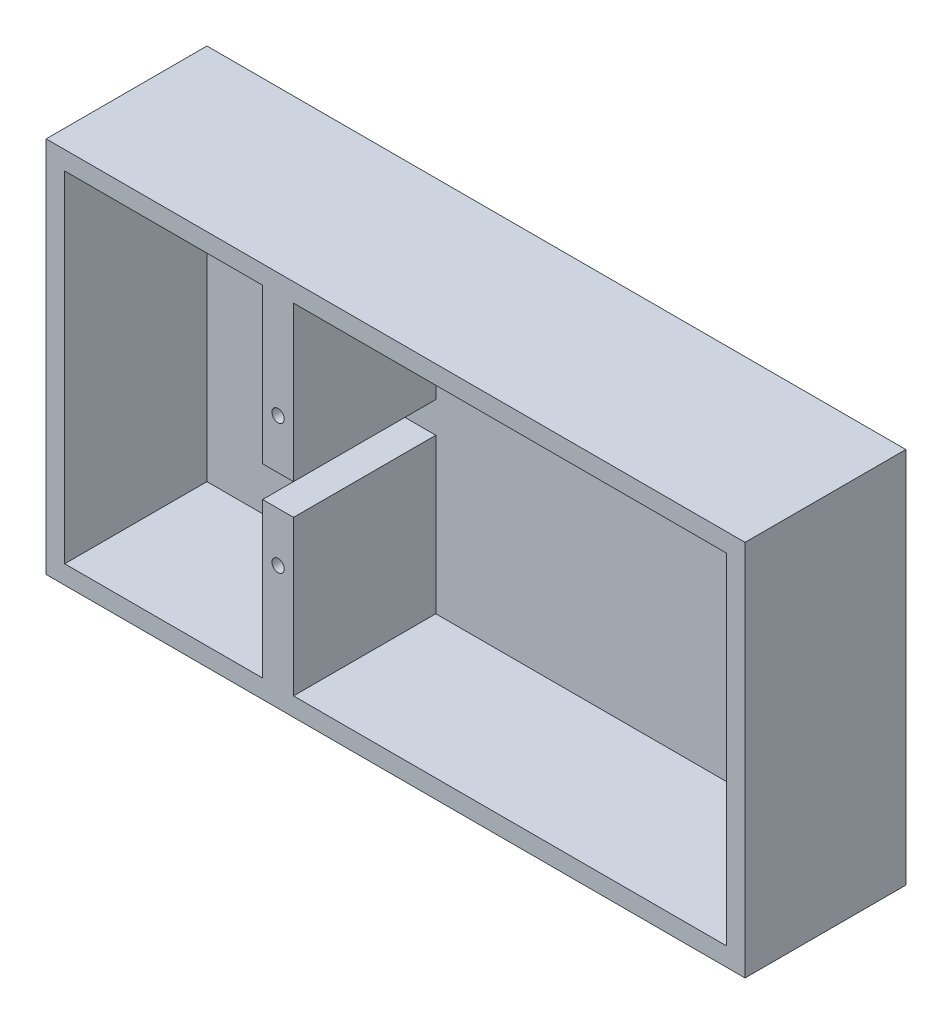
ISO-10303-21;
HEADER;
FILE_DESCRIPTION(('STEP AP214'),'2;1');
FILE_NAME('part.step','',(''),(''),'','','');
FILE_SCHEMA(('AUTOMOTIVE_DESIGN { 1 0 10303 214 1 1 1 1 }'));
ENDSEC;
DATA;
#1=APPLICATION_CONTEXT('core data for automotive mechanical design processes');
#2=APPLICATION_PROTOCOL_DEFINITION('international standard','automotive_design',2000,#1);
#3=PRODUCT_CONTEXT('',#1,'mechanical');
#4=PRODUCT('Part','Part','',(#3));
#5=PRODUCT_RELATED_PRODUCT_CATEGORY('part','',(#4));
#6=PRODUCT_DEFINITION_FORMATION('','',#4);
#7=PRODUCT_DEFINITION_CONTEXT('part definition',#1,'design');
#8=PRODUCT_DEFINITION('design','',#6,#7);
#9=PRODUCT_DEFINITION_SHAPE('','',#8);
#10=(LENGTH_UNIT() NAMED_UNIT(*) SI_UNIT(.MILLI.,.METRE.));
#11=(NAMED_UNIT(*) PLANE_ANGLE_UNIT() SI_UNIT($,.RADIAN.));
#12=(NAMED_UNIT(*) SI_UNIT($,.STERADIAN.) SOLID_ANGLE_UNIT());
#13=UNCERTAINTY_MEASURE_WITH_UNIT(LENGTH_MEASURE(1.E-05),#10,'distance_accuracy_value','');
#14=(GEOMETRIC_REPRESENTATION_CONTEXT(3) GLOBAL_UNCERTAINTY_ASSIGNED_CONTEXT((#13)) GLOBAL_UNIT_ASSIGNED_CONTEXT((#10,
#11,#12)) REPRESENTATION_CONTEXT('',''));
#15=CARTESIAN_POINT('',(0.,0.,0.));
#16=DIRECTION('',(0.,0.,1.));
#17=DIRECTION('',(1.,0.,0.));
#18=AXIS2_PLACEMENT_3D('',#15,#16,#17);
#19=CARTESIAN_POINT('',(-73.,58.,26.));
#20=DIRECTION('',(1.,0.,0.));
#21=DIRECTION('',(0.,0.,-1.));
#22=AXIS2_PLACEMENT_3D('',#19,#20,#21);
#23=PLANE('',#22);
#24=DIRECTION('',(0.,0.,1.));
#25=VECTOR('',#24,1.);
#26=CARTESIAN_POINT('',(-73.,33.,26.));
#27=LINE('',#26,#25);
#28=CARTESIAN_POINT('',(-73.,33.,3.00000000000001));
#29=VERTEX_POINT('',#28);
#30=CARTESIAN_POINT('',(-73.,33.,26.));
#31=VERTEX_POINT('',#30);
#32=EDGE_CURVE('E159',#29,#31,#27,.T.);
#33=ORIENTED_EDGE('',*,*,#32,.F.);
#34=DIRECTION('',(0.,1.,0.));
#35=VECTOR('',#34,1.);
#36=CARTESIAN_POINT('',(-73.,58.,3.));
#37=LINE('',#36,#35);
#38=CARTESIAN_POINT('',(-73.,58.,3.));
#39=VERTEX_POINT('',#38);
#40=EDGE_CURVE('E278',#29,#39,#37,.T.);
#41=ORIENTED_EDGE('',*,*,#40,.T.);
#42=DIRECTION('',(0.,0.,-1.));
#43=VECTOR('',#42,1.);
#44=CARTESIAN_POINT('',(-73.,58.,26.));
#45=LINE('',#44,#43);
#46=CARTESIAN_POINT('',(-73.,58.,26.));
#47=VERTEX_POINT('',#46);
#48=EDGE_CURVE('E201',#47,#39,#45,.T.);
#49=ORIENTED_EDGE('',*,*,#48,.F.);
#50=DIRECTION('',(0.,-1.,0.));
#51=VECTOR('',#50,1.);
#52=CARTESIAN_POINT('',(-73.,58.,26.));
#53=LINE('',#52,#51);
#54=EDGE_CURVE('E191',#47,#31,#53,.T.);
#55=ORIENTED_EDGE('',*,*,#54,.T.);
#56=EDGE_LOOP('',(#33,#41,#49,#55));
#57=FACE_BOUND('',#56,.T.);
#58=ADVANCED_FACE('F33',(#57),#23,.T.);
#59=CARTESIAN_POINT('',(-78.,58.,26.));
#60=DIRECTION('',(-1.,0.,0.));
#61=DIRECTION('',(0.,-1.,0.));
#62=AXIS2_PLACEMENT_3D('',#59,#60,#61);
#63=PLANE('',#62);
#64=DIRECTION('',(0.,0.,1.));
#65=VECTOR('',#64,1.);
#66=CARTESIAN_POINT('',(-78.,33.,26.));
#67=LINE('',#66,#65);
#68=CARTESIAN_POINT('',(-78.,33.,3.));
#69=VERTEX_POINT('',#68);
#70=CARTESIAN_POINT('',(-78.,33.,26.));
#71=VERTEX_POINT('',#70);
#72=EDGE_CURVE('E50',#69,#71,#67,.T.);
#73=ORIENTED_EDGE('',*,*,#72,.T.);
#74=DIRECTION('',(0.,1.,0.));
#75=VECTOR('',#74,1.);
#76=CARTESIAN_POINT('',(-78.,58.,26.));
#77=LINE('',#76,#75);
#78=CARTESIAN_POINT('',(-78.,58.,26.));
#79=VERTEX_POINT('',#78);
#80=EDGE_CURVE('E176',#71,#79,#77,.T.);
#81=ORIENTED_EDGE('',*,*,#80,.T.);
#82=DIRECTION('',(0.,0.,-1.));
#83=VECTOR('',#82,1.);
#84=CARTESIAN_POINT('',(-78.,58.,26.));
#85=LINE('',#84,#83);
#86=CARTESIAN_POINT('',(-78.,58.,3.00000000000001));
#87=VERTEX_POINT('',#86);
#88=EDGE_CURVE('E185',#79,#87,#85,.T.);
#89=ORIENTED_EDGE('',*,*,#88,.T.);
#90=DIRECTION('',(0.,-1.,0.));
#91=VECTOR('',#90,1.);
#92=CARTESIAN_POINT('',(-78.,3.,3.));
#93=LINE('',#92,#91);
#94=EDGE_CURVE('E272',#87,#69,#93,.T.);
#95=ORIENTED_EDGE('',*,*,#94,.T.);
#96=EDGE_LOOP('',(#73,#81,#89,#95));
#97=FACE_BOUND('',#96,.T.);
#98=ADVANCED_FACE('F303',(#97),#63,.T.);
#99=CARTESIAN_POINT('',(0.,0.,26.));
#100=DIRECTION('',(0.,0.,1.));
#101=DIRECTION('',(1.,0.,0.));
#102=AXIS2_PLACEMENT_3D('',#99,#100,#101);
#103=PLANE('',#102);
#104=CARTESIAN_POINT('',(-75.5,20.,26.));
#105=DIRECTION('',(0.,0.,1.));
#106=DIRECTION('',(1.,0.,0.));
#107=AXIS2_PLACEMENT_3D('',#104,#105,#106);
#108=CIRCLE('',#107,0.999999999999998);
#109=CARTESIAN_POINT('',(-74.5,20.,26.));
#110=VERTEX_POINT('',#109);
#111=EDGE_CURVE('E255',#110,#110,#108,.T.);
#112=ORIENTED_EDGE('',*,*,#111,.F.);
#113=EDGE_LOOP('',(#112));
#114=FACE_BOUND('',#113,.T.);
#115=CARTESIAN_POINT('',(-75.5,41.,26.));
#116=DIRECTION('',(0.,0.,1.));
#117=DIRECTION('',(1.,0.,0.));
#118=AXIS2_PLACEMENT_3D('',#115,#116,#117);
#119=CIRCLE('',#118,0.999999999999998);
#120=CARTESIAN_POINT('',(-74.5,41.,26.));
#121=VERTEX_POINT('',#120);
#122=EDGE_CURVE('E245',#121,#121,#119,.T.);
#123=ORIENTED_EDGE('',*,*,#122,.F.);
#124=EDGE_LOOP('',(#123));
#125=FACE_BOUND('',#124,.T.);
#126=DIRECTION('',(1.,0.,0.));
#127=VECTOR('',#126,1.);
#128=CARTESIAN_POINT('',(-78.,33.,26.));
#129=LINE('',#128,#127);
#130=EDGE_CURVE('E261',#71,#31,#129,.T.);
#131=ORIENTED_EDGE('',*,*,#130,.T.);
#132=ORIENTED_EDGE('',*,*,#54,.F.);
#133=DIRECTION('',(-1.,0.,0.));
#134=VECTOR('',#133,1.);
#135=CARTESIAN_POINT('',(-73.,58.,26.));
#136=LINE('',#135,#134);
#137=CARTESIAN_POINT('',(-3.,58.,26.));
#138=VERTEX_POINT('',#137);
#139=EDGE_CURVE('E199',#138,#47,#136,.T.);
#140=ORIENTED_EDGE('',*,*,#139,.F.);
#141=DIRECTION('',(0.,1.,0.));
#142=VECTOR('',#141,1.);
#143=CARTESIAN_POINT('',(-3.,58.,26.));
#144=LINE('',#143,#142);
#145=CARTESIAN_POINT('',(-3.,3.,26.));
#146=VERTEX_POINT('',#145);
#147=EDGE_CURVE('E196',#146,#138,#144,.T.);
#148=ORIENTED_EDGE('',*,*,#147,.F.);
#149=DIRECTION('',(1.,0.,0.));
#150=VECTOR('',#149,1.);
#151=CARTESIAN_POINT('',(-73.,3.,26.));
#152=LINE('',#151,#150);
#153=CARTESIAN_POINT('',(-73.,3.,26.));
#154=VERTEX_POINT('',#153);
#155=EDGE_CURVE('E194',#154,#146,#152,.T.);
#156=ORIENTED_EDGE('',*,*,#155,.F.);
#157=CARTESIAN_POINT('',(-73.,28.,26.));
#158=VERTEX_POINT('',#157);
#159=EDGE_CURVE('E170',#158,#154,#53,.T.);
#160=ORIENTED_EDGE('',*,*,#159,.F.);
#161=DIRECTION('',(1.,0.,0.));
#162=VECTOR('',#161,1.);
#163=CARTESIAN_POINT('',(-78.,28.,26.));
#164=LINE('',#163,#162);
#165=CARTESIAN_POINT('',(-78.,28.,26.));
#166=VERTEX_POINT('',#165);
#167=EDGE_CURVE('E153',#166,#158,#164,.T.);
#168=ORIENTED_EDGE('',*,*,#167,.F.);
#169=CARTESIAN_POINT('',(-78.,3.,26.));
#170=VERTEX_POINT('',#169);
#171=EDGE_CURVE('E168',#170,#166,#77,.T.);
#172=ORIENTED_EDGE('',*,*,#171,.F.);
#173=DIRECTION('',(1.,0.,0.));
#174=VECTOR('',#173,1.);
#175=CARTESIAN_POINT('',(-110.,3.,26.));
#176=LINE('',#175,#174);
#177=CARTESIAN_POINT('',(-110.,3.,26.));
#178=VERTEX_POINT('',#177);
#179=EDGE_CURVE('E180',#178,#170,#176,.T.);
#180=ORIENTED_EDGE('',*,*,#179,.F.);
#181=DIRECTION('',(0.,-1.,0.));
#182=VECTOR('',#181,1.);
#183=CARTESIAN_POINT('',(-110.,58.,26.));
#184=LINE('',#183,#182);
#185=CARTESIAN_POINT('',(-110.,58.,26.));
#186=VERTEX_POINT('',#185);
#187=EDGE_CURVE('E285',#186,#178,#184,.T.);
#188=ORIENTED_EDGE('',*,*,#187,.F.);
#189=DIRECTION('',(-1.,0.,0.));
#190=VECTOR('',#189,1.);
#191=CARTESIAN_POINT('',(-110.,58.,26.));
#192=LINE('',#191,#190);
#193=EDGE_CURVE('E175',#79,#186,#192,.T.);
#194=ORIENTED_EDGE('',*,*,#193,.F.);
#195=ORIENTED_EDGE('',*,*,#80,.F.);
#196=EDGE_LOOP('',(#131,#132,#140,#148,#156,#160,#168,#172,#180,#188,#194,#195));
#197=FACE_BOUND('',#196,.T.);
#198=DIRECTION('',(0.,-1.,0.));
#199=VECTOR('',#198,1.);
#200=CARTESIAN_POINT('',(-113.,61.,26.));
#201=LINE('',#200,#199);
#202=CARTESIAN_POINT('',(-113.,61.,26.));
#203=VERTEX_POINT('',#202);
#204=CARTESIAN_POINT('',(-113.,0.,26.));
#205=VERTEX_POINT('',#204);
#206=EDGE_CURVE('E214',#203,#205,#201,.T.);
#207=ORIENTED_EDGE('',*,*,#206,.T.);
#208=DIRECTION('',(1.,0.,0.));
#209=VECTOR('',#208,1.);
#210=CARTESIAN_POINT('',(-113.,0.,26.));
#211=LINE('',#210,#209);
#212=CARTESIAN_POINT('',(0.,0.,26.));
#213=VERTEX_POINT('',#212);
#214=EDGE_CURVE('E217',#205,#213,#211,.T.);
#215=ORIENTED_EDGE('',*,*,#214,.T.);
#216=DIRECTION('',(0.,1.,0.));
#217=VECTOR('',#216,1.);
#218=CARTESIAN_POINT('',(0.,61.,26.));
#219=LINE('',#218,#217);
#220=CARTESIAN_POINT('',(0.,61.,26.));
#221=VERTEX_POINT('',#220);
#222=EDGE_CURVE('E220',#213,#221,#219,.T.);
#223=ORIENTED_EDGE('',*,*,#222,.T.);
#224=DIRECTION('',(-1.,0.,0.));
#225=VECTOR('',#224,1.);
#226=CARTESIAN_POINT('',(-113.,61.,26.));
#227=LINE('',#226,#225);
#228=EDGE_CURVE('E222',#221,#203,#227,.T.);
#229=ORIENTED_EDGE('',*,*,#228,.T.);
#230=EDGE_LOOP('',(#207,#215,#223,#229));
#231=FACE_BOUND('',#230,.T.);
#232=ADVANCED_FACE('F165',(#114,#125,#197,#231),#103,.T.);
#233=CARTESIAN_POINT('',(0.,0.,0.));
#234=DIRECTION('',(0.,0.,1.));
#235=DIRECTION('',(1.,0.,0.));
#236=AXIS2_PLACEMENT_3D('',#233,#234,#235);
#237=PLANE('',#236);
#238=CARTESIAN_POINT('',(-75.5,20.,0.));
#239=DIRECTION('',(0.,0.,1.));
#240=DIRECTION('',(1.,0.,0.));
#241=AXIS2_PLACEMENT_3D('',#238,#239,#240);
#242=CIRCLE('',#241,0.999999999999998);
#243=CARTESIAN_POINT('',(-74.5,20.,0.));
#244=VERTEX_POINT('',#243);
#245=EDGE_CURVE('E37',#244,#244,#242,.T.);
#246=ORIENTED_EDGE('',*,*,#245,.T.);
#247=EDGE_LOOP('',(#246));
#248=FACE_BOUND('',#247,.T.);
#249=CARTESIAN_POINT('',(-75.5,41.,0.));
#250=DIRECTION('',(0.,0.,1.));
#251=DIRECTION('',(1.,0.,0.));
#252=AXIS2_PLACEMENT_3D('',#249,#250,#251);
#253=CIRCLE('',#252,0.999999999999998);
#254=CARTESIAN_POINT('',(-74.5,41.,0.));
#255=VERTEX_POINT('',#254);
#256=EDGE_CURVE('E243',#255,#255,#253,.T.);
#257=ORIENTED_EDGE('',*,*,#256,.T.);
#258=EDGE_LOOP('',(#257));
#259=FACE_BOUND('',#258,.T.);
#260=DIRECTION('',(0.,-1.,0.));
#261=VECTOR('',#260,1.);
#262=CARTESIAN_POINT('',(-113.,61.,0.));
#263=LINE('',#262,#261);
#264=CARTESIAN_POINT('',(-113.,61.,0.));
#265=VERTEX_POINT('',#264);
#266=CARTESIAN_POINT('',(-113.,0.,0.));
#267=VERTEX_POINT('',#266);
#268=EDGE_CURVE('E213',#265,#267,#263,.T.);
#269=ORIENTED_EDGE('',*,*,#268,.F.);
#270=DIRECTION('',(-1.,0.,0.));
#271=VECTOR('',#270,1.);
#272=CARTESIAN_POINT('',(-113.,61.,0.));
#273=LINE('',#272,#271);
#274=CARTESIAN_POINT('',(0.,61.,0.));
#275=VERTEX_POINT('',#274);
#276=EDGE_CURVE('E218',#275,#265,#273,.T.);
#277=ORIENTED_EDGE('',*,*,#276,.F.);
#278=DIRECTION('',(0.,1.,0.));
#279=VECTOR('',#278,1.);
#280=CARTESIAN_POINT('',(0.,61.,0.));
#281=LINE('',#280,#279);
#282=CARTESIAN_POINT('',(0.,0.,0.));
#283=VERTEX_POINT('',#282);
#284=EDGE_CURVE('E229',#283,#275,#281,.T.);
#285=ORIENTED_EDGE('',*,*,#284,.F.);
#286=DIRECTION('',(1.,0.,0.));
#287=VECTOR('',#286,1.);
#288=CARTESIAN_POINT('',(-113.,0.,0.));
#289=LINE('',#288,#287);
#290=EDGE_CURVE('E227',#267,#283,#289,.T.);
#291=ORIENTED_EDGE('',*,*,#290,.F.);
#292=EDGE_LOOP('',(#269,#277,#285,#291));
#293=FACE_BOUND('',#292,.T.);
#294=ADVANCED_FACE('F310',(#248,#259,#293),#237,.F.);
#295=CARTESIAN_POINT('',(-113.,61.,26.));
#296=DIRECTION('',(1.,0.,0.));
#297=DIRECTION('',(0.,1.,0.));
#298=AXIS2_PLACEMENT_3D('',#295,#296,#297);
#299=PLANE('',#298);
#300=ORIENTED_EDGE('',*,*,#268,.T.);
#301=DIRECTION('',(0.,0.,-1.));
#302=VECTOR('',#301,1.);
#303=CARTESIAN_POINT('',(-113.,0.,26.));
#304=LINE('',#303,#302);
#305=EDGE_CURVE('E11',#205,#267,#304,.T.);
#306=ORIENTED_EDGE('',*,*,#305,.F.);
#307=ORIENTED_EDGE('',*,*,#206,.F.);
#308=DIRECTION('',(0.,0.,-1.));
#309=VECTOR('',#308,1.);
#310=CARTESIAN_POINT('',(-113.,61.,26.));
#311=LINE('',#310,#309);
#312=EDGE_CURVE('E224',#203,#265,#311,.T.);
#313=ORIENTED_EDGE('',*,*,#312,.T.);
#314=EDGE_LOOP('',(#300,#306,#307,#313));
#315=FACE_BOUND('',#314,.T.);
#316=ADVANCED_FACE('F35',(#315),#299,.F.);
#317=CARTESIAN_POINT('',(-113.,0.,26.));
#318=DIRECTION('',(0.,1.,0.));
#319=DIRECTION('',(0.,0.,1.));
#320=AXIS2_PLACEMENT_3D('',#317,#318,#319);
#321=PLANE('',#320);
#322=CARTESIAN_POINT('',(-12.5,0.,8.));
#323=DIRECTION('',(0.,-1.,0.));
#324=DIRECTION('',(0.,0.,-1.));
#325=AXIS2_PLACEMENT_3D('',#322,#323,#324);
#326=CIRCLE('',#325,4.);
#327=CARTESIAN_POINT('',(-12.5,0.,4.));
#328=VERTEX_POINT('',#327);
#329=EDGE_CURVE('E242',#328,#328,#326,.T.);
#330=ORIENTED_EDGE('',*,*,#329,.F.);
#331=EDGE_LOOP('',(#330));
#332=FACE_BOUND('',#331,.T.);
#333=ORIENTED_EDGE('',*,*,#290,.T.);
#334=DIRECTION('',(0.,0.,-1.));
#335=VECTOR('',#334,1.);
#336=CARTESIAN_POINT('',(0.,0.,26.));
#337=LINE('',#336,#335);
#338=EDGE_CURVE('E42',#213,#283,#337,.T.);
#339=ORIENTED_EDGE('',*,*,#338,.F.);
#340=ORIENTED_EDGE('',*,*,#214,.F.);
#341=ORIENTED_EDGE('',*,*,#305,.T.);
#342=EDGE_LOOP('',(#333,#339,#340,#341));
#343=FACE_BOUND('',#342,.T.);
#344=ADVANCED_FACE('F351',(#332,#343),#321,.F.);
#345=CARTESIAN_POINT('',(0.,61.,26.));
#346=DIRECTION('',(-1.,0.,0.));
#347=DIRECTION('',(0.,0.,1.));
#348=AXIS2_PLACEMENT_3D('',#345,#346,#347);
#349=PLANE('',#348);
#350=ORIENTED_EDGE('',*,*,#284,.T.);
#351=DIRECTION('',(0.,0.,-1.));
#352=VECTOR('',#351,1.);
#353=CARTESIAN_POINT('',(0.,61.,26.));
#354=LINE('',#353,#352);
#355=EDGE_CURVE('E234',#221,#275,#354,.T.);
#356=ORIENTED_EDGE('',*,*,#355,.F.);
#357=ORIENTED_EDGE('',*,*,#222,.F.);
#358=ORIENTED_EDGE('',*,*,#338,.T.);
#359=EDGE_LOOP('',(#350,#356,#357,#358));
#360=FACE_BOUND('',#359,.T.);
#361=ADVANCED_FACE('F348',(#360),#349,.F.);
#362=CARTESIAN_POINT('',(-113.,61.,26.));
#363=DIRECTION('',(0.,-1.,0.));
#364=DIRECTION('',(1.,0.,0.));
#365=AXIS2_PLACEMENT_3D('',#362,#363,#364);
#366=PLANE('',#365);
#367=ORIENTED_EDGE('',*,*,#276,.T.);
#368=ORIENTED_EDGE('',*,*,#312,.F.);
#369=ORIENTED_EDGE('',*,*,#228,.F.);
#370=ORIENTED_EDGE('',*,*,#355,.T.);
#371=EDGE_LOOP('',(#367,#368,#369,#370));
#372=FACE_BOUND('',#371,.T.);
#373=ADVANCED_FACE('F340',(#372),#366,.F.);
#374=DIRECTION('',(0.,0.,-1.));
#375=VECTOR('',#374,1.);
#376=CARTESIAN_POINT('',(-73.,28.,26.));
#377=LINE('',#376,#375);
#378=CARTESIAN_POINT('',(-73.,28.,3.00000000000001));
#379=VERTEX_POINT('',#378);
#380=EDGE_CURVE('E241',#158,#379,#377,.T.);
#381=ORIENTED_EDGE('',*,*,#380,.F.);
#382=ORIENTED_EDGE('',*,*,#159,.T.);
#383=DIRECTION('',(0.,0.,-1.));
#384=VECTOR('',#383,1.);
#385=CARTESIAN_POINT('',(-73.,3.,26.));
#386=LINE('',#385,#384);
#387=CARTESIAN_POINT('',(-73.,3.,3.00000000000001));
#388=VERTEX_POINT('',#387);
#389=EDGE_CURVE('E210',#154,#388,#386,.T.);
#390=ORIENTED_EDGE('',*,*,#389,.T.);
#391=EDGE_CURVE('E279',#388,#379,#37,.T.);
#392=ORIENTED_EDGE('',*,*,#391,.T.);
#393=EDGE_LOOP('',(#381,#382,#390,#392));
#394=FACE_BOUND('',#393,.T.);
#395=ADVANCED_FACE('F315',(#394),#23,.T.);
#396=CARTESIAN_POINT('',(-73.,3.,26.));
#397=DIRECTION('',(0.,1.,0.));
#398=DIRECTION('',(-1.,0.,0.));
#399=AXIS2_PLACEMENT_3D('',#396,#397,#398);
#400=PLANE('',#399);
#401=CARTESIAN_POINT('',(-12.5,3.,8.));
#402=DIRECTION('',(0.,1.,0.));
#403=DIRECTION('',(-1.,0.,0.));
#404=AXIS2_PLACEMENT_3D('',#401,#402,#403);
#405=CIRCLE('',#404,4.);
#406=CARTESIAN_POINT('',(-16.5,3.,8.));
#407=VERTEX_POINT('',#406);
#408=EDGE_CURVE('E239',#407,#407,#405,.T.);
#409=ORIENTED_EDGE('',*,*,#408,.F.);
#410=EDGE_LOOP('',(#409));
#411=FACE_BOUND('',#410,.T.);
#412=DIRECTION('',(-1.,0.,0.));
#413=VECTOR('',#412,1.);
#414=CARTESIAN_POINT('',(-73.,3.,3.));
#415=LINE('',#414,#413);
#416=CARTESIAN_POINT('',(-3.,3.,3.00000000000001));
#417=VERTEX_POINT('',#416);
#418=EDGE_CURVE('E276',#417,#388,#415,.T.);
#419=ORIENTED_EDGE('',*,*,#418,.T.);
#420=ORIENTED_EDGE('',*,*,#389,.F.);
#421=ORIENTED_EDGE('',*,*,#155,.T.);
#422=DIRECTION('',(0.,0.,-1.));
#423=VECTOR('',#422,1.);
#424=CARTESIAN_POINT('',(-3.,3.,26.));
#425=LINE('',#424,#423);
#426=EDGE_CURVE('E207',#146,#417,#425,.T.);
#427=ORIENTED_EDGE('',*,*,#426,.T.);
#428=EDGE_LOOP('',(#419,#420,#421,#427));
#429=FACE_BOUND('',#428,.T.);
#430=ADVANCED_FACE('F335',(#411,#429),#400,.T.);
#431=CARTESIAN_POINT('',(-3.,58.,26.));
#432=DIRECTION('',(-1.,0.,0.));
#433=DIRECTION('',(0.,-1.,0.));
#434=AXIS2_PLACEMENT_3D('',#431,#432,#433);
#435=PLANE('',#434);
#436=DIRECTION('',(0.,-1.,0.));
#437=VECTOR('',#436,1.);
#438=CARTESIAN_POINT('',(-3.,3.,3.));
#439=LINE('',#438,#437);
#440=CARTESIAN_POINT('',(-3.,58.,3.00000000000001));
#441=VERTEX_POINT('',#440);
#442=EDGE_CURVE('E284',#441,#417,#439,.T.);
#443=ORIENTED_EDGE('',*,*,#442,.T.);
#444=ORIENTED_EDGE('',*,*,#426,.F.);
#445=ORIENTED_EDGE('',*,*,#147,.T.);
#446=DIRECTION('',(0.,0.,-1.));
#447=VECTOR('',#446,1.);
#448=CARTESIAN_POINT('',(-3.,58.,26.));
#449=LINE('',#448,#447);
#450=EDGE_CURVE('E204',#138,#441,#449,.T.);
#451=ORIENTED_EDGE('',*,*,#450,.T.);
#452=EDGE_LOOP('',(#443,#444,#445,#451));
#453=FACE_BOUND('',#452,.T.);
#454=ADVANCED_FACE('F331',(#453),#435,.T.);
#455=CARTESIAN_POINT('',(-73.,58.,26.));
#456=DIRECTION('',(0.,-1.,0.));
#457=DIRECTION('',(0.,0.,-1.));
#458=AXIS2_PLACEMENT_3D('',#455,#456,#457);
#459=PLANE('',#458);
#460=DIRECTION('',(1.,0.,0.));
#461=VECTOR('',#460,1.);
#462=CARTESIAN_POINT('',(-3.,58.,3.));
#463=LINE('',#462,#461);
#464=EDGE_CURVE('E282',#39,#441,#463,.T.);
#465=ORIENTED_EDGE('',*,*,#464,.T.);
#466=ORIENTED_EDGE('',*,*,#450,.F.);
#467=ORIENTED_EDGE('',*,*,#139,.T.);
#468=ORIENTED_EDGE('',*,*,#48,.T.);
#469=EDGE_LOOP('',(#465,#466,#467,#468));
#470=FACE_BOUND('',#469,.T.);
#471=ADVANCED_FACE('F326',(#470),#459,.T.);
#472=CARTESIAN_POINT('',(-110.,58.,26.));
#473=DIRECTION('',(1.,0.,0.));
#474=DIRECTION('',(0.,0.,-1.));
#475=AXIS2_PLACEMENT_3D('',#472,#473,#474);
#476=PLANE('',#475);
#477=DIRECTION('',(0.,1.,0.));
#478=VECTOR('',#477,1.);
#479=CARTESIAN_POINT('',(-110.,58.,3.));
#480=LINE('',#479,#478);
#481=CARTESIAN_POINT('',(-110.,3.,3.00000000000001));
#482=VERTEX_POINT('',#481);
#483=CARTESIAN_POINT('',(-110.,58.,3.));
#484=VERTEX_POINT('',#483);
#485=EDGE_CURVE('E263',#482,#484,#480,.T.);
#486=ORIENTED_EDGE('',*,*,#485,.T.);
#487=DIRECTION('',(0.,0.,-1.));
#488=VECTOR('',#487,1.);
#489=CARTESIAN_POINT('',(-110.,58.,26.));
#490=LINE('',#489,#488);
#491=EDGE_CURVE('E178',#186,#484,#490,.T.);
#492=ORIENTED_EDGE('',*,*,#491,.F.);
#493=ORIENTED_EDGE('',*,*,#187,.T.);
#494=DIRECTION('',(0.,0.,-1.));
#495=VECTOR('',#494,1.);
#496=CARTESIAN_POINT('',(-110.,3.,26.));
#497=LINE('',#496,#495);
#498=EDGE_CURVE('E189',#178,#482,#497,.T.);
#499=ORIENTED_EDGE('',*,*,#498,.T.);
#500=EDGE_LOOP('',(#486,#492,#493,#499));
#501=FACE_BOUND('',#500,.T.);
#502=ADVANCED_FACE('F295',(#501),#476,.T.);
#503=CARTESIAN_POINT('',(-110.,3.,26.));
#504=DIRECTION('',(0.,1.,0.));
#505=DIRECTION('',(0.,0.,1.));
#506=AXIS2_PLACEMENT_3D('',#503,#504,#505);
#507=PLANE('',#506);
#508=DIRECTION('',(-1.,0.,0.));
#509=VECTOR('',#508,1.);
#510=CARTESIAN_POINT('',(-110.,3.,3.));
#511=LINE('',#510,#509);
#512=CARTESIAN_POINT('',(-78.,3.,3.00000000000001));
#513=VERTEX_POINT('',#512);
#514=EDGE_CURVE('E58',#513,#482,#511,.T.);
#515=ORIENTED_EDGE('',*,*,#514,.T.);
#516=ORIENTED_EDGE('',*,*,#498,.F.);
#517=ORIENTED_EDGE('',*,*,#179,.T.);
#518=DIRECTION('',(0.,0.,-1.));
#519=VECTOR('',#518,1.);
#520=CARTESIAN_POINT('',(-78.,3.,26.));
#521=LINE('',#520,#519);
#522=EDGE_CURVE('E174',#170,#513,#521,.T.);
#523=ORIENTED_EDGE('',*,*,#522,.T.);
#524=EDGE_LOOP('',(#515,#516,#517,#523));
#525=FACE_BOUND('',#524,.T.);
#526=ADVANCED_FACE('F289',(#525),#507,.T.);
#527=DIRECTION('',(0.,0.,-1.));
#528=VECTOR('',#527,1.);
#529=CARTESIAN_POINT('',(-78.,28.,26.));
#530=LINE('',#529,#528);
#531=CARTESIAN_POINT('',(-78.,28.,3.00000000000001));
#532=VERTEX_POINT('',#531);
#533=EDGE_CURVE('E149',#166,#532,#530,.T.);
#534=ORIENTED_EDGE('',*,*,#533,.T.);
#535=EDGE_CURVE('E271',#532,#513,#93,.T.);
#536=ORIENTED_EDGE('',*,*,#535,.T.);
#537=ORIENTED_EDGE('',*,*,#522,.F.);
#538=ORIENTED_EDGE('',*,*,#171,.T.);
#539=EDGE_LOOP('',(#534,#536,#537,#538));
#540=FACE_BOUND('',#539,.T.);
#541=ADVANCED_FACE('F173',(#540),#63,.T.);
#542=CARTESIAN_POINT('',(-110.,58.,26.));
#543=DIRECTION('',(0.,-1.,0.));
#544=DIRECTION('',(1.,0.,0.));
#545=AXIS2_PLACEMENT_3D('',#542,#543,#544);
#546=PLANE('',#545);
#547=DIRECTION('',(1.,0.,0.));
#548=VECTOR('',#547,1.);
#549=CARTESIAN_POINT('',(-78.,58.,3.));
#550=LINE('',#549,#548);
#551=EDGE_CURVE('E269',#484,#87,#550,.T.);
#552=ORIENTED_EDGE('',*,*,#551,.T.);
#553=ORIENTED_EDGE('',*,*,#88,.F.);
#554=ORIENTED_EDGE('',*,*,#193,.T.);
#555=ORIENTED_EDGE('',*,*,#491,.T.);
#556=EDGE_LOOP('',(#552,#553,#554,#555));
#557=FACE_BOUND('',#556,.T.);
#558=ADVANCED_FACE('F294',(#557),#546,.T.);
#559=CARTESIAN_POINT('',(0.,0.,3.));
#560=DIRECTION('',(0.,0.,1.));
#561=DIRECTION('',(1.,0.,0.));
#562=AXIS2_PLACEMENT_3D('',#559,#560,#561);
#563=PLANE('',#562);
#564=ORIENTED_EDGE('',*,*,#418,.F.);
#565=ORIENTED_EDGE('',*,*,#442,.F.);
#566=ORIENTED_EDGE('',*,*,#464,.F.);
#567=ORIENTED_EDGE('',*,*,#40,.F.);
#568=DIRECTION('',(1.,0.,0.));
#569=VECTOR('',#568,1.);
#570=CARTESIAN_POINT('',(-78.,33.,3.00000000000001));
#571=LINE('',#570,#569);
#572=EDGE_CURVE('E264',#69,#29,#571,.T.);
#573=ORIENTED_EDGE('',*,*,#572,.F.);
#574=ORIENTED_EDGE('',*,*,#94,.F.);
#575=ORIENTED_EDGE('',*,*,#551,.F.);
#576=ORIENTED_EDGE('',*,*,#485,.F.);
#577=ORIENTED_EDGE('',*,*,#514,.F.);
#578=ORIENTED_EDGE('',*,*,#535,.F.);
#579=DIRECTION('',(1.,0.,0.));
#580=VECTOR('',#579,1.);
#581=CARTESIAN_POINT('',(-78.,28.,3.00000000000001));
#582=LINE('',#581,#580);
#583=EDGE_CURVE('E155',#532,#379,#582,.T.);
#584=ORIENTED_EDGE('',*,*,#583,.T.);
#585=ORIENTED_EDGE('',*,*,#391,.F.);
#586=EDGE_LOOP('',(#564,#565,#566,#567,#573,#574,#575,#576,#577,#578,#584,#585));
#587=FACE_BOUND('',#586,.T.);
#588=ADVANCED_FACE('F301',(#587),#563,.T.);
#589=CARTESIAN_POINT('',(-78.,33.,26.));
#590=DIRECTION('',(0.,1.,0.));
#591=DIRECTION('',(0.,0.,1.));
#592=AXIS2_PLACEMENT_3D('',#589,#590,#591);
#593=PLANE('',#592);
#594=ORIENTED_EDGE('',*,*,#32,.T.);
#595=ORIENTED_EDGE('',*,*,#130,.F.);
#596=ORIENTED_EDGE('',*,*,#72,.F.);
#597=ORIENTED_EDGE('',*,*,#572,.T.);
#598=EDGE_LOOP('',(#594,#595,#596,#597));
#599=FACE_BOUND('',#598,.T.);
#600=ADVANCED_FACE('F384',(#599),#593,.F.);
#601=CARTESIAN_POINT('',(-78.,28.,26.));
#602=DIRECTION('',(0.,-1.,0.));
#603=DIRECTION('',(0.,0.,-1.));
#604=AXIS2_PLACEMENT_3D('',#601,#602,#603);
#605=PLANE('',#604);
#606=ORIENTED_EDGE('',*,*,#380,.T.);
#607=ORIENTED_EDGE('',*,*,#583,.F.);
#608=ORIENTED_EDGE('',*,*,#533,.F.);
#609=ORIENTED_EDGE('',*,*,#167,.T.);
#610=EDGE_LOOP('',(#606,#607,#608,#609));
#611=FACE_BOUND('',#610,.T.);
#612=ADVANCED_FACE('F152',(#611),#605,.F.);
#613=CARTESIAN_POINT('',(-12.5,10.,8.));
#614=DIRECTION('',(0.,-1.,0.));
#615=DIRECTION('',(0.,0.,-1.));
#616=AXIS2_PLACEMENT_3D('',#613,#614,#615);
#617=CYLINDRICAL_SURFACE('',#616,4.);
#618=ORIENTED_EDGE('',*,*,#408,.T.);
#619=EDGE_LOOP('',(#618));
#620=FACE_BOUND('',#619,.T.);
#621=ORIENTED_EDGE('',*,*,#329,.T.);
#622=EDGE_LOOP('',(#621));
#623=FACE_BOUND('',#622,.T.);
#624=ADVANCED_FACE('F373',(#620,#623),#617,.F.);
#625=CARTESIAN_POINT('',(-75.5,41.,-4.));
#626=DIRECTION('',(0.,0.,1.));
#627=DIRECTION('',(1.,0.,0.));
#628=AXIS2_PLACEMENT_3D('',#625,#626,#627);
#629=CYLINDRICAL_SURFACE('',#628,0.999999999999998);
#630=ORIENTED_EDGE('',*,*,#122,.T.);
#631=EDGE_LOOP('',(#630));
#632=FACE_BOUND('',#631,.T.);
#633=ORIENTED_EDGE('',*,*,#256,.F.);
#634=EDGE_LOOP('',(#633));
#635=FACE_BOUND('',#634,.T.);
#636=ADVANCED_FACE('F375',(#632,#635),#629,.F.);
#637=CARTESIAN_POINT('',(-75.5,20.,-4.));
#638=DIRECTION('',(0.,0.,1.));
#639=DIRECTION('',(1.,0.,0.));
#640=AXIS2_PLACEMENT_3D('',#637,#638,#639);
#641=CYLINDRICAL_SURFACE('',#640,0.999999999999998);
#642=ORIENTED_EDGE('',*,*,#111,.T.);
#643=EDGE_LOOP('',(#642));
#644=FACE_BOUND('',#643,.T.);
#645=ORIENTED_EDGE('',*,*,#245,.F.);
#646=EDGE_LOOP('',(#645));
#647=FACE_BOUND('',#646,.T.);
#648=ADVANCED_FACE('F382',(#644,#647),#641,.F.);
#649=CLOSED_SHELL('',(#58,#98,#232,#294,#316,#344,#361,#373,#395,#430,#454,#471,#502,#526,#541,
#558,#588,#600,#612,#624,#636,#648));
#650=MANIFOLD_SOLID_BREP('B2',#649);
#651=ADVANCED_BREP_SHAPE_REPRESENTATION('',(#18,#650),#14);
#652=SHAPE_DEFINITION_REPRESENTATION(#9,#651);
ENDSEC;
END-ISO-10303-21;
